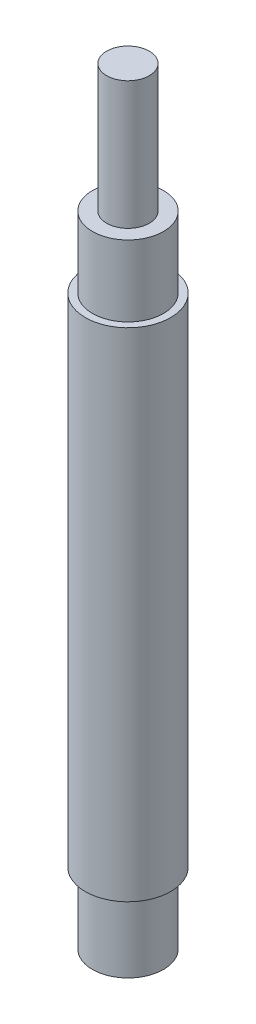
ISO-10303-21;
HEADER;
FILE_DESCRIPTION(('STEP AP214'),'2;1');
FILE_NAME('part.step','',(''),(''),'','','');
FILE_SCHEMA(('AUTOMOTIVE_DESIGN { 1 0 10303 214 1 1 1 1 }'));
ENDSEC;
DATA;
#1=APPLICATION_CONTEXT('core data for automotive mechanical design processes');
#2=APPLICATION_PROTOCOL_DEFINITION('international standard','automotive_design',2000,#1);
#3=PRODUCT_CONTEXT('',#1,'mechanical');
#4=PRODUCT('Part','Part','',(#3));
#5=PRODUCT_RELATED_PRODUCT_CATEGORY('part','',(#4));
#6=PRODUCT_DEFINITION_FORMATION('','',#4);
#7=PRODUCT_DEFINITION_CONTEXT('part definition',#1,'design');
#8=PRODUCT_DEFINITION('design','',#6,#7);
#9=PRODUCT_DEFINITION_SHAPE('','',#8);
#10=(LENGTH_UNIT() NAMED_UNIT(*) SI_UNIT(.MILLI.,.METRE.));
#11=(NAMED_UNIT(*) PLANE_ANGLE_UNIT() SI_UNIT($,.RADIAN.));
#12=(NAMED_UNIT(*) SI_UNIT($,.STERADIAN.) SOLID_ANGLE_UNIT());
#13=UNCERTAINTY_MEASURE_WITH_UNIT(LENGTH_MEASURE(1.E-05),#10,'distance_accuracy_value','');
#14=(GEOMETRIC_REPRESENTATION_CONTEXT(3) GLOBAL_UNCERTAINTY_ASSIGNED_CONTEXT((#13)) GLOBAL_UNIT_ASSIGNED_CONTEXT((#10,
#11,#12)) REPRESENTATION_CONTEXT('',''));
#15=CARTESIAN_POINT('',(0.,0.,0.));
#16=DIRECTION('',(0.,0.,1.));
#17=DIRECTION('',(1.,0.,0.));
#18=AXIS2_PLACEMENT_3D('',#15,#16,#17);
#19=CARTESIAN_POINT('',(0.,90.,0.));
#20=DIRECTION('',(0.,1.,0.));
#21=DIRECTION('',(0.,0.,1.));
#22=AXIS2_PLACEMENT_3D('',#19,#20,#21);
#23=PLANE('',#22);
#24=CARTESIAN_POINT('',(0.,90.,0.));
#25=DIRECTION('',(0.,1.,0.));
#26=DIRECTION('',(0.,0.,1.));
#27=AXIS2_PLACEMENT_3D('',#24,#25,#26);
#28=CIRCLE('',#27,5.);
#29=CARTESIAN_POINT('',(0.,90.,5.));
#30=VERTEX_POINT('',#29);
#31=EDGE_CURVE('E48',#30,#30,#28,.T.);
#32=ORIENTED_EDGE('',*,*,#31,.T.);
#33=EDGE_LOOP('',(#32));
#34=FACE_BOUND('',#33,.T.);
#35=CARTESIAN_POINT('',(0.,90.,0.));
#36=DIRECTION('',(0.,1.,0.));
#37=DIRECTION('',(0.,0.,1.));
#38=AXIS2_PLACEMENT_3D('',#35,#36,#37);
#39=CIRCLE('',#38,3.);
#40=CARTESIAN_POINT('',(0.,90.,3.));
#41=VERTEX_POINT('',#40);
#42=EDGE_CURVE('E57',#41,#41,#39,.T.);
#43=ORIENTED_EDGE('',*,*,#42,.F.);
#44=EDGE_LOOP('',(#43));
#45=FACE_BOUND('',#44,.T.);
#46=ADVANCED_FACE('F32',(#34,#45),#23,.T.);
#47=CARTESIAN_POINT('',(0.,80.,0.));
#48=DIRECTION('',(0.,1.,0.));
#49=DIRECTION('',(0.,0.,1.));
#50=AXIS2_PLACEMENT_3D('',#47,#48,#49);
#51=PLANE('',#50);
#52=CARTESIAN_POINT('',(0.,80.,0.));
#53=DIRECTION('',(0.,1.,0.));
#54=DIRECTION('',(0.,0.,1.));
#55=AXIS2_PLACEMENT_3D('',#52,#53,#54);
#56=CIRCLE('',#55,6.);
#57=CARTESIAN_POINT('',(0.,80.,6.));
#58=VERTEX_POINT('',#57);
#59=EDGE_CURVE('E43',#58,#58,#56,.T.);
#60=ORIENTED_EDGE('',*,*,#59,.T.);
#61=EDGE_LOOP('',(#60));
#62=FACE_BOUND('',#61,.T.);
#63=CARTESIAN_POINT('',(0.,80.,0.));
#64=DIRECTION('',(0.,1.,0.));
#65=DIRECTION('',(0.,0.,1.));
#66=AXIS2_PLACEMENT_3D('',#63,#64,#65);
#67=CIRCLE('',#66,5.);
#68=CARTESIAN_POINT('',(0.,80.,5.));
#69=VERTEX_POINT('',#68);
#70=EDGE_CURVE('E51',#69,#69,#67,.T.);
#71=ORIENTED_EDGE('',*,*,#70,.F.);
#72=EDGE_LOOP('',(#71));
#73=FACE_BOUND('',#72,.T.);
#74=ADVANCED_FACE('F73',(#62,#73),#51,.T.);
#75=CARTESIAN_POINT('',(0.,10.,0.));
#76=DIRECTION('',(0.,-1.,0.));
#77=DIRECTION('',(0.,0.,-1.));
#78=AXIS2_PLACEMENT_3D('',#75,#76,#77);
#79=CYLINDRICAL_SURFACE('',#78,5.);
#80=CARTESIAN_POINT('',(0.,10.,0.));
#81=DIRECTION('',(0.,1.,0.));
#82=DIRECTION('',(0.,0.,1.));
#83=AXIS2_PLACEMENT_3D('',#80,#81,#82);
#84=CIRCLE('',#83,5.);
#85=CARTESIAN_POINT('',(0.,10.,5.));
#86=VERTEX_POINT('',#85);
#87=EDGE_CURVE('E10',#86,#86,#84,.T.);
#88=ORIENTED_EDGE('',*,*,#87,.F.);
#89=EDGE_LOOP('',(#88));
#90=FACE_BOUND('',#89,.T.);
#91=CARTESIAN_POINT('',(0.,0.,0.));
#92=DIRECTION('',(0.,1.,0.));
#93=DIRECTION('',(0.,0.,1.));
#94=AXIS2_PLACEMENT_3D('',#91,#92,#93);
#95=CIRCLE('',#94,5.);
#96=CARTESIAN_POINT('',(0.,0.,5.));
#97=VERTEX_POINT('',#96);
#98=EDGE_CURVE('E36',#97,#97,#95,.T.);
#99=ORIENTED_EDGE('',*,*,#98,.T.);
#100=EDGE_LOOP('',(#99));
#101=FACE_BOUND('',#100,.T.);
#102=ADVANCED_FACE('F34',(#90,#101),#79,.T.);
#103=CARTESIAN_POINT('',(0.,0.,0.));
#104=DIRECTION('',(0.,1.,0.));
#105=DIRECTION('',(0.,0.,1.));
#106=AXIS2_PLACEMENT_3D('',#103,#104,#105);
#107=PLANE('',#106);
#108=ORIENTED_EDGE('',*,*,#98,.F.);
#109=EDGE_LOOP('',(#108));
#110=FACE_BOUND('',#109,.T.);
#111=ADVANCED_FACE('F90',(#110),#107,.F.);
#112=CARTESIAN_POINT('',(0.,10.,0.));
#113=DIRECTION('',(0.,1.,0.));
#114=DIRECTION('',(0.,0.,1.));
#115=AXIS2_PLACEMENT_3D('',#112,#113,#114);
#116=PLANE('',#115);
#117=CARTESIAN_POINT('',(0.,10.,0.));
#118=DIRECTION('',(0.,1.,0.));
#119=DIRECTION('',(0.,0.,1.));
#120=AXIS2_PLACEMENT_3D('',#117,#118,#119);
#121=CIRCLE('',#120,6.);
#122=CARTESIAN_POINT('',(0.,10.,6.));
#123=VERTEX_POINT('',#122);
#124=EDGE_CURVE('E45',#123,#123,#121,.T.);
#125=ORIENTED_EDGE('',*,*,#124,.F.);
#126=EDGE_LOOP('',(#125));
#127=FACE_BOUND('',#126,.T.);
#128=ORIENTED_EDGE('',*,*,#87,.T.);
#129=EDGE_LOOP('',(#128));
#130=FACE_BOUND('',#129,.T.);
#131=ADVANCED_FACE('F87',(#127,#130),#116,.F.);
#132=CARTESIAN_POINT('',(0.,80.,0.));
#133=DIRECTION('',(0.,-1.,0.));
#134=DIRECTION('',(0.,0.,-1.));
#135=AXIS2_PLACEMENT_3D('',#132,#133,#134);
#136=CYLINDRICAL_SURFACE('',#135,6.);
#137=ORIENTED_EDGE('',*,*,#59,.F.);
#138=EDGE_LOOP('',(#137));
#139=FACE_BOUND('',#138,.T.);
#140=ORIENTED_EDGE('',*,*,#124,.T.);
#141=EDGE_LOOP('',(#140));
#142=FACE_BOUND('',#141,.T.);
#143=ADVANCED_FACE('F84',(#139,#142),#136,.T.);
#144=CARTESIAN_POINT('',(0.,90.,0.));
#145=DIRECTION('',(0.,-1.,0.));
#146=DIRECTION('',(0.,0.,-1.));
#147=AXIS2_PLACEMENT_3D('',#144,#145,#146);
#148=CYLINDRICAL_SURFACE('',#147,5.);
#149=ORIENTED_EDGE('',*,*,#31,.F.);
#150=EDGE_LOOP('',(#149));
#151=FACE_BOUND('',#150,.T.);
#152=ORIENTED_EDGE('',*,*,#70,.T.);
#153=EDGE_LOOP('',(#152));
#154=FACE_BOUND('',#153,.T.);
#155=ADVANCED_FACE('F68',(#151,#154),#148,.T.);
#156=CARTESIAN_POINT('',(0.,108.,0.));
#157=DIRECTION('',(0.,-1.,0.));
#158=DIRECTION('',(0.,0.,-1.));
#159=AXIS2_PLACEMENT_3D('',#156,#157,#158);
#160=CYLINDRICAL_SURFACE('',#159,3.);
#161=CARTESIAN_POINT('',(0.,108.,0.));
#162=DIRECTION('',(0.,1.,0.));
#163=DIRECTION('',(0.,0.,1.));
#164=AXIS2_PLACEMENT_3D('',#161,#162,#163);
#165=CIRCLE('',#164,3.);
#166=CARTESIAN_POINT('',(0.,108.,3.));
#167=VERTEX_POINT('',#166);
#168=EDGE_CURVE('E54',#167,#167,#165,.T.);
#169=ORIENTED_EDGE('',*,*,#168,.F.);
#170=EDGE_LOOP('',(#169));
#171=FACE_BOUND('',#170,.T.);
#172=ORIENTED_EDGE('',*,*,#42,.T.);
#173=EDGE_LOOP('',(#172));
#174=FACE_BOUND('',#173,.T.);
#175=ADVANCED_FACE('F65',(#171,#174),#160,.T.);
#176=CARTESIAN_POINT('',(0.,108.,0.));
#177=DIRECTION('',(0.,1.,0.));
#178=DIRECTION('',(0.,0.,1.));
#179=AXIS2_PLACEMENT_3D('',#176,#177,#178);
#180=PLANE('',#179);
#181=ORIENTED_EDGE('',*,*,#168,.T.);
#182=EDGE_LOOP('',(#181));
#183=FACE_BOUND('',#182,.T.);
#184=ADVANCED_FACE('F63',(#183),#180,.T.);
#185=CLOSED_SHELL('',(#46,#74,#102,#111,#131,#143,#155,#175,#184));
#186=MANIFOLD_SOLID_BREP('B2',#185);
#187=ADVANCED_BREP_SHAPE_REPRESENTATION('',(#18,#186),#14);
#188=SHAPE_DEFINITION_REPRESENTATION(#9,#187);
ENDSEC;
END-ISO-10303-21;
